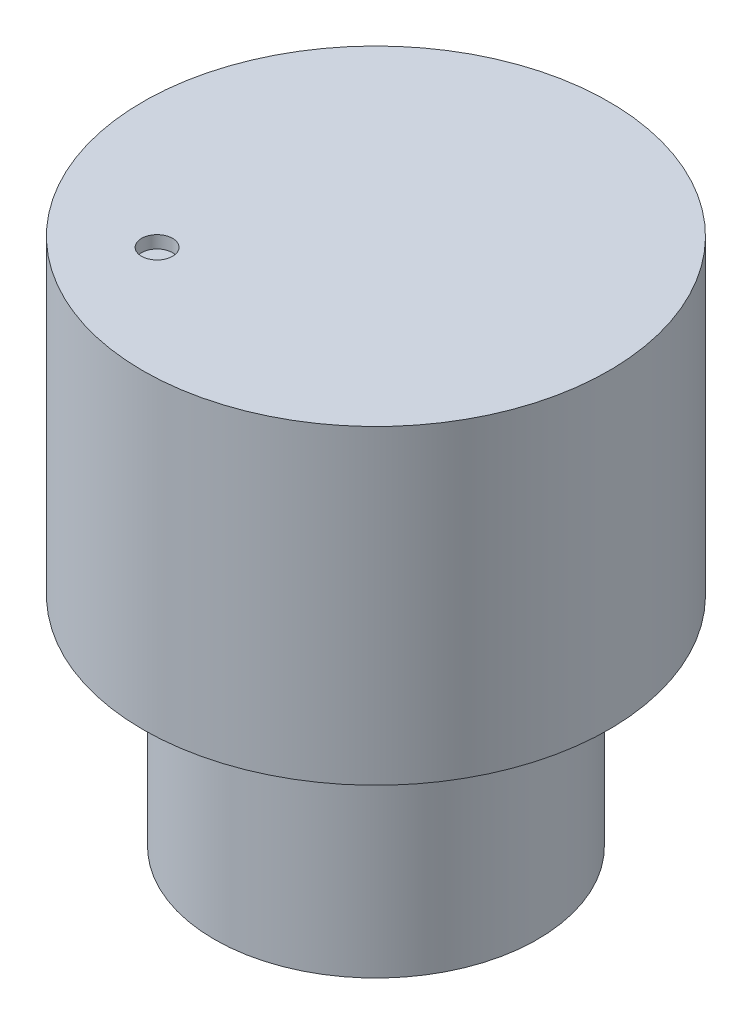
ISO-10303-21;
HEADER;
FILE_DESCRIPTION(('STEP AP214'),'2;1');
FILE_NAME('part.step','',(''),(''),'','','');
FILE_SCHEMA(('AUTOMOTIVE_DESIGN { 1 0 10303 214 1 1 1 1 }'));
ENDSEC;
DATA;
#1=APPLICATION_CONTEXT('core data for automotive mechanical design processes');
#2=APPLICATION_PROTOCOL_DEFINITION('international standard','automotive_design',2000,#1);
#3=PRODUCT_CONTEXT('',#1,'mechanical');
#4=PRODUCT('Part','Part','',(#3));
#5=PRODUCT_RELATED_PRODUCT_CATEGORY('part','',(#4));
#6=PRODUCT_DEFINITION_FORMATION('','',#4);
#7=PRODUCT_DEFINITION_CONTEXT('part definition',#1,'design');
#8=PRODUCT_DEFINITION('design','',#6,#7);
#9=PRODUCT_DEFINITION_SHAPE('','',#8);
#10=(LENGTH_UNIT() NAMED_UNIT(*) SI_UNIT(.MILLI.,.METRE.));
#11=(NAMED_UNIT(*) PLANE_ANGLE_UNIT() SI_UNIT($,.RADIAN.));
#12=(NAMED_UNIT(*) SI_UNIT($,.STERADIAN.) SOLID_ANGLE_UNIT());
#13=UNCERTAINTY_MEASURE_WITH_UNIT(LENGTH_MEASURE(1.E-05),#10,'distance_accuracy_value','');
#14=(GEOMETRIC_REPRESENTATION_CONTEXT(3) GLOBAL_UNCERTAINTY_ASSIGNED_CONTEXT((#13)) GLOBAL_UNIT_ASSIGNED_CONTEXT((#10,
#11,#12)) REPRESENTATION_CONTEXT('',''));
#15=CARTESIAN_POINT('',(0.,0.,0.));
#16=DIRECTION('',(0.,0.,1.));
#17=DIRECTION('',(1.,0.,0.));
#18=AXIS2_PLACEMENT_3D('',#15,#16,#17);
#19=CARTESIAN_POINT('',(0.,7.,0.));
#20=DIRECTION('',(0.,-1.,0.));
#21=DIRECTION('',(0.,0.,-1.));
#22=AXIS2_PLACEMENT_3D('',#19,#20,#21);
#23=CYLINDRICAL_SURFACE('',#22,3.2);
#24=DIRECTION('',(0.,1.,0.));
#25=VECTOR('',#24,1.);
#26=CARTESIAN_POINT('',(-2.64575131106459,2.,-1.8));
#27=LINE('',#26,#25);
#28=CARTESIAN_POINT('',(-2.64575131106459,2.,-1.8));
#29=VERTEX_POINT('',#28);
#30=CARTESIAN_POINT('',(-2.64575131106459,7.,-1.8));
#31=VERTEX_POINT('',#30);
#32=EDGE_CURVE('E90',#29,#31,#27,.T.);
#33=ORIENTED_EDGE('',*,*,#32,.T.);
#34=CARTESIAN_POINT('',(0.,7.,0.));
#35=DIRECTION('',(0.,1.,0.));
#36=DIRECTION('',(0.,0.,1.));
#37=AXIS2_PLACEMENT_3D('',#34,#35,#36);
#38=CIRCLE('',#37,3.2);
#39=CARTESIAN_POINT('',(-3.17490157327751,7.,-0.4));
#40=VERTEX_POINT('',#39);
#41=EDGE_CURVE('E142',#31,#40,#38,.T.);
#42=ORIENTED_EDGE('',*,*,#41,.T.);
#43=DIRECTION('',(0.,1.,0.));
#44=VECTOR('',#43,1.);
#45=CARTESIAN_POINT('',(-3.17490157327751,6.,-0.4));
#46=LINE('',#45,#44);
#47=CARTESIAN_POINT('',(-3.17490157327751,6.,-0.4));
#48=VERTEX_POINT('',#47);
#49=EDGE_CURVE('E130',#48,#40,#46,.T.);
#50=ORIENTED_EDGE('',*,*,#49,.F.);
#51=CARTESIAN_POINT('',(0.,6.,0.));
#52=DIRECTION('',(0.,-1.,0.));
#53=DIRECTION('',(0.,0.,-1.));
#54=AXIS2_PLACEMENT_3D('',#51,#52,#53);
#55=CIRCLE('',#54,3.2);
#56=CARTESIAN_POINT('',(-3.17490157327751,6.,0.4));
#57=VERTEX_POINT('',#56);
#58=EDGE_CURVE('E112',#57,#48,#55,.T.);
#59=ORIENTED_EDGE('',*,*,#58,.F.);
#60=DIRECTION('',(0.,1.,0.));
#61=VECTOR('',#60,1.);
#62=CARTESIAN_POINT('',(-3.17490157327751,6.,0.4));
#63=LINE('',#62,#61);
#64=CARTESIAN_POINT('',(-3.17490157327751,7.,0.4));
#65=VERTEX_POINT('',#64);
#66=EDGE_CURVE('E121',#57,#65,#63,.T.);
#67=ORIENTED_EDGE('',*,*,#66,.T.);
#68=CARTESIAN_POINT('',(3.17490157327751,7.,0.4));
#69=VERTEX_POINT('',#68);
#70=EDGE_CURVE('E137',#65,#69,#38,.T.);
#71=ORIENTED_EDGE('',*,*,#70,.T.);
#72=DIRECTION('',(0.,1.,0.));
#73=VECTOR('',#72,1.);
#74=CARTESIAN_POINT('',(3.17490157327751,6.,0.4));
#75=LINE('',#74,#73);
#76=CARTESIAN_POINT('',(3.17490157327751,6.,0.4));
#77=VERTEX_POINT('',#76);
#78=EDGE_CURVE('E60',#77,#69,#75,.T.);
#79=ORIENTED_EDGE('',*,*,#78,.F.);
#80=CARTESIAN_POINT('',(3.17490157327751,6.,-0.4));
#81=VERTEX_POINT('',#80);
#82=EDGE_CURVE('E117',#81,#77,#55,.T.);
#83=ORIENTED_EDGE('',*,*,#82,.F.);
#84=DIRECTION('',(0.,1.,0.));
#85=VECTOR('',#84,1.);
#86=CARTESIAN_POINT('',(3.17490157327751,6.,-0.4));
#87=LINE('',#86,#85);
#88=CARTESIAN_POINT('',(3.17490157327751,7.,-0.4));
#89=VERTEX_POINT('',#88);
#90=EDGE_CURVE('E127',#81,#89,#87,.T.);
#91=ORIENTED_EDGE('',*,*,#90,.T.);
#92=CARTESIAN_POINT('',(2.64575131106459,7.,-1.8));
#93=VERTEX_POINT('',#92);
#94=EDGE_CURVE('E143',#89,#93,#38,.T.);
#95=ORIENTED_EDGE('',*,*,#94,.T.);
#96=DIRECTION('',(0.,1.,0.));
#97=VECTOR('',#96,1.);
#98=CARTESIAN_POINT('',(2.64575131106459,2.,-1.8));
#99=LINE('',#98,#97);
#100=CARTESIAN_POINT('',(2.64575131106459,2.,-1.8));
#101=VERTEX_POINT('',#100);
#102=EDGE_CURVE('E52',#101,#93,#99,.T.);
#103=ORIENTED_EDGE('',*,*,#102,.F.);
#104=CARTESIAN_POINT('',(0.,2.,0.));
#105=DIRECTION('',(0.,-1.,0.));
#106=DIRECTION('',(0.,0.,-1.));
#107=AXIS2_PLACEMENT_3D('',#104,#105,#106);
#108=CIRCLE('',#107,3.2);
#109=EDGE_CURVE('E102',#29,#101,#108,.T.);
#110=ORIENTED_EDGE('',*,*,#109,.F.);
#111=EDGE_LOOP('',(#33,#42,#50,#59,#67,#71,#79,#83,#91,#95,#103,#110));
#112=FACE_BOUND('',#111,.T.);
#113=CARTESIAN_POINT('',(0.,0.,0.));
#114=DIRECTION('',(0.,1.,0.));
#115=DIRECTION('',(0.,0.,1.));
#116=AXIS2_PLACEMENT_3D('',#113,#114,#115);
#117=CIRCLE('',#116,3.2);
#118=CARTESIAN_POINT('',(0.,0.,3.2));
#119=VERTEX_POINT('',#118);
#120=EDGE_CURVE('E144',#119,#119,#117,.T.);
#121=ORIENTED_EDGE('',*,*,#120,.F.);
#122=EDGE_LOOP('',(#121));
#123=FACE_BOUND('',#122,.T.);
#124=ADVANCED_FACE('F37',(#112,#123),#23,.F.);
#125=CARTESIAN_POINT('',(0.,7.,0.));
#126=DIRECTION('',(0.,1.,0.));
#127=DIRECTION('',(0.,0.,1.));
#128=AXIS2_PLACEMENT_3D('',#125,#126,#127);
#129=PLANE('',#128);
#130=ORIENTED_EDGE('',*,*,#41,.F.);
#131=DIRECTION('',(1.,0.,0.));
#132=VECTOR('',#131,1.);
#133=CARTESIAN_POINT('',(0.,7.,-1.8));
#134=LINE('',#133,#132);
#135=EDGE_CURVE('E94',#31,#93,#134,.T.);
#136=ORIENTED_EDGE('',*,*,#135,.T.);
#137=ORIENTED_EDGE('',*,*,#94,.F.);
#138=DIRECTION('',(1.,0.,0.));
#139=VECTOR('',#138,1.);
#140=CARTESIAN_POINT('',(0.,7.,-0.4));
#141=LINE('',#140,#139);
#142=EDGE_CURVE('E98',#40,#89,#141,.T.);
#143=ORIENTED_EDGE('',*,*,#142,.F.);
#144=EDGE_LOOP('',(#130,#136,#137,#143));
#145=FACE_BOUND('',#144,.T.);
#146=ADVANCED_FACE('F157',(#145),#129,.F.);
#147=CARTESIAN_POINT('',(0.,0.,0.));
#148=DIRECTION('',(0.,1.,0.));
#149=DIRECTION('',(0.,0.,1.));
#150=AXIS2_PLACEMENT_3D('',#147,#148,#149);
#151=PLANE('',#150);
#152=CARTESIAN_POINT('',(0.,0.,0.));
#153=DIRECTION('',(0.,1.,0.));
#154=DIRECTION('',(0.,0.,1.));
#155=AXIS2_PLACEMENT_3D('',#152,#153,#154);
#156=CIRCLE('',#155,5.2);
#157=CARTESIAN_POINT('',(0.,0.,5.2));
#158=VERTEX_POINT('',#157);
#159=EDGE_CURVE('E41',#158,#158,#156,.T.);
#160=ORIENTED_EDGE('',*,*,#159,.F.);
#161=EDGE_LOOP('',(#160));
#162=FACE_BOUND('',#161,.T.);
#163=ORIENTED_EDGE('',*,*,#120,.T.);
#164=EDGE_LOOP('',(#163));
#165=FACE_BOUND('',#164,.T.);
#166=ADVANCED_FACE('F159',(#162,#165),#151,.F.);
#167=CARTESIAN_POINT('',(0.,7.,0.));
#168=DIRECTION('',(0.,-1.,0.));
#169=DIRECTION('',(0.,0.,-1.));
#170=AXIS2_PLACEMENT_3D('',#167,#168,#169);
#171=CYLINDRICAL_SURFACE('',#170,5.2);
#172=CARTESIAN_POINT('',(0.,7.,0.));
#173=DIRECTION('',(0.,1.,0.));
#174=DIRECTION('',(0.,0.,1.));
#175=AXIS2_PLACEMENT_3D('',#172,#173,#174);
#176=CIRCLE('',#175,5.2);
#177=CARTESIAN_POINT('',(0.,7.,5.2));
#178=VERTEX_POINT('',#177);
#179=EDGE_CURVE('E11',#178,#178,#176,.T.);
#180=ORIENTED_EDGE('',*,*,#179,.F.);
#181=EDGE_LOOP('',(#180));
#182=FACE_BOUND('',#181,.T.);
#183=ORIENTED_EDGE('',*,*,#159,.T.);
#184=EDGE_LOOP('',(#183));
#185=FACE_BOUND('',#184,.T.);
#186=ADVANCED_FACE('F39',(#182,#185),#171,.T.);
#187=ORIENTED_EDGE('',*,*,#70,.F.);
#188=DIRECTION('',(1.,0.,0.));
#189=VECTOR('',#188,1.);
#190=CARTESIAN_POINT('',(0.,7.,0.4));
#191=LINE('',#190,#189);
#192=EDGE_CURVE('E116',#65,#69,#191,.T.);
#193=ORIENTED_EDGE('',*,*,#192,.T.);
#194=EDGE_LOOP('',(#187,#193));
#195=FACE_BOUND('',#194,.T.);
#196=ADVANCED_FACE('F161',(#195),#129,.F.);
#197=CARTESIAN_POINT('',(0.,17.,0.));
#198=DIRECTION('',(0.,-1.,0.));
#199=DIRECTION('',(0.,0.,-1.));
#200=AXIS2_PLACEMENT_3D('',#197,#198,#199);
#201=CYLINDRICAL_SURFACE('',#200,7.5);
#202=CARTESIAN_POINT('',(0.,17.,0.));
#203=DIRECTION('',(0.,1.,0.));
#204=DIRECTION('',(0.,0.,1.));
#205=AXIS2_PLACEMENT_3D('',#202,#203,#204);
#206=CIRCLE('',#205,7.5);
#207=CARTESIAN_POINT('',(0.,17.,7.5));
#208=VERTEX_POINT('',#207);
#209=EDGE_CURVE('E134',#208,#208,#206,.T.);
#210=ORIENTED_EDGE('',*,*,#209,.F.);
#211=EDGE_LOOP('',(#210));
#212=FACE_BOUND('',#211,.T.);
#213=CARTESIAN_POINT('',(0.,7.,0.));
#214=DIRECTION('',(0.,1.,0.));
#215=DIRECTION('',(0.,0.,1.));
#216=AXIS2_PLACEMENT_3D('',#213,#214,#215);
#217=CIRCLE('',#216,7.5);
#218=CARTESIAN_POINT('',(0.,7.,7.5));
#219=VERTEX_POINT('',#218);
#220=EDGE_CURVE('E133',#219,#219,#217,.T.);
#221=ORIENTED_EDGE('',*,*,#220,.T.);
#222=EDGE_LOOP('',(#221));
#223=FACE_BOUND('',#222,.T.);
#224=ADVANCED_FACE('F172',(#212,#223),#201,.T.);
#225=CARTESIAN_POINT('',(0.,17.,0.));
#226=DIRECTION('',(0.,1.,0.));
#227=DIRECTION('',(0.,0.,1.));
#228=AXIS2_PLACEMENT_3D('',#225,#226,#227);
#229=PLANE('',#228);
#230=CARTESIAN_POINT('',(-3.21393804843267,17.,3.83022221559491));
#231=DIRECTION('',(0.,1.,0.));
#232=DIRECTION('',(0.,0.,1.));
#233=AXIS2_PLACEMENT_3D('',#230,#231,#232);
#234=CIRCLE('',#233,0.5);
#235=CARTESIAN_POINT('',(-3.21393804843267,17.,4.33022221559491));
#236=VERTEX_POINT('',#235);
#237=EDGE_CURVE('E305',#236,#236,#234,.T.);
#238=ORIENTED_EDGE('',*,*,#237,.F.);
#239=EDGE_LOOP('',(#238));
#240=FACE_BOUND('',#239,.T.);
#241=ORIENTED_EDGE('',*,*,#209,.T.);
#242=EDGE_LOOP('',(#241));
#243=FACE_BOUND('',#242,.T.);
#244=ADVANCED_FACE('F175',(#240,#243),#229,.T.);
#245=ORIENTED_EDGE('',*,*,#179,.T.);
#246=EDGE_LOOP('',(#245));
#247=FACE_BOUND('',#246,.T.);
#248=ORIENTED_EDGE('',*,*,#220,.F.);
#249=EDGE_LOOP('',(#248));
#250=FACE_BOUND('',#249,.T.);
#251=ADVANCED_FACE('F162',(#247,#250),#129,.F.);
#252=CARTESIAN_POINT('',(0.,6.,-0.4));
#253=DIRECTION('',(0.,0.,1.));
#254=DIRECTION('',(1.,0.,0.));
#255=AXIS2_PLACEMENT_3D('',#252,#253,#254);
#256=PLANE('',#255);
#257=ORIENTED_EDGE('',*,*,#142,.T.);
#258=ORIENTED_EDGE('',*,*,#90,.F.);
#259=DIRECTION('',(1.,0.,0.));
#260=VECTOR('',#259,1.);
#261=CARTESIAN_POINT('',(0.,6.,-0.4));
#262=LINE('',#261,#260);
#263=EDGE_CURVE('E115',#48,#81,#262,.T.);
#264=ORIENTED_EDGE('',*,*,#263,.F.);
#265=ORIENTED_EDGE('',*,*,#49,.T.);
#266=EDGE_LOOP('',(#257,#258,#264,#265));
#267=FACE_BOUND('',#266,.T.);
#268=ADVANCED_FACE('F155',(#267),#256,.F.);
#269=CARTESIAN_POINT('',(0.,6.,0.4));
#270=DIRECTION('',(0.,0.,1.));
#271=DIRECTION('',(1.,0.,0.));
#272=AXIS2_PLACEMENT_3D('',#269,#270,#271);
#273=PLANE('',#272);
#274=ORIENTED_EDGE('',*,*,#192,.F.);
#275=ORIENTED_EDGE('',*,*,#66,.F.);
#276=DIRECTION('',(1.,0.,0.));
#277=VECTOR('',#276,1.);
#278=CARTESIAN_POINT('',(0.,6.,0.4));
#279=LINE('',#278,#277);
#280=EDGE_CURVE('E119',#57,#77,#279,.T.);
#281=ORIENTED_EDGE('',*,*,#280,.T.);
#282=ORIENTED_EDGE('',*,*,#78,.T.);
#283=EDGE_LOOP('',(#274,#275,#281,#282));
#284=FACE_BOUND('',#283,.T.);
#285=ADVANCED_FACE('F181',(#284),#273,.T.);
#286=CARTESIAN_POINT('',(0.,6.,0.));
#287=DIRECTION('',(0.,-1.,0.));
#288=DIRECTION('',(0.,0.,-1.));
#289=AXIS2_PLACEMENT_3D('',#286,#287,#288);
#290=PLANE('',#289);
#291=ORIENTED_EDGE('',*,*,#58,.T.);
#292=ORIENTED_EDGE('',*,*,#263,.T.);
#293=ORIENTED_EDGE('',*,*,#82,.T.);
#294=ORIENTED_EDGE('',*,*,#280,.F.);
#295=EDGE_LOOP('',(#291,#292,#293,#294));
#296=FACE_BOUND('',#295,.T.);
#297=ADVANCED_FACE('F237',(#296),#290,.T.);
#298=CARTESIAN_POINT('',(0.,2.,-1.8));
#299=DIRECTION('',(0.,0.,1.));
#300=DIRECTION('',(1.,0.,0.));
#301=AXIS2_PLACEMENT_3D('',#298,#299,#300);
#302=PLANE('',#301);
#303=ORIENTED_EDGE('',*,*,#135,.F.);
#304=ORIENTED_EDGE('',*,*,#32,.F.);
#305=DIRECTION('',(1.,0.,0.));
#306=VECTOR('',#305,1.);
#307=CARTESIAN_POINT('',(0.,2.,-1.8));
#308=LINE('',#307,#306);
#309=EDGE_CURVE('E93',#29,#101,#308,.T.);
#310=ORIENTED_EDGE('',*,*,#309,.T.);
#311=ORIENTED_EDGE('',*,*,#102,.T.);
#312=EDGE_LOOP('',(#303,#304,#310,#311));
#313=FACE_BOUND('',#312,.T.);
#314=ADVANCED_FACE('F92',(#313),#302,.T.);
#315=CARTESIAN_POINT('',(0.,2.,0.));
#316=DIRECTION('',(0.,-1.,0.));
#317=DIRECTION('',(0.,0.,-1.));
#318=AXIS2_PLACEMENT_3D('',#315,#316,#317);
#319=PLANE('',#318);
#320=ORIENTED_EDGE('',*,*,#309,.F.);
#321=ORIENTED_EDGE('',*,*,#109,.T.);
#322=EDGE_LOOP('',(#320,#321));
#323=FACE_BOUND('',#322,.T.);
#324=ADVANCED_FACE('F101',(#323),#319,.T.);
#325=CARTESIAN_POINT('',(-3.21393804843267,16.6,3.83022221559491));
#326=DIRECTION('',(0.,1.,0.));
#327=DIRECTION('',(0.,0.,1.));
#328=AXIS2_PLACEMENT_3D('',#325,#326,#327);
#329=CYLINDRICAL_SURFACE('',#328,0.5);
#330=CARTESIAN_POINT('',(-3.21393804843267,16.6,3.83022221559491));
#331=DIRECTION('',(0.,1.,0.));
#332=DIRECTION('',(0.,0.,1.));
#333=AXIS2_PLACEMENT_3D('',#330,#331,#332);
#334=CIRCLE('',#333,0.5);
#335=CARTESIAN_POINT('',(-3.21393804843267,16.6,4.33022221559491));
#336=VERTEX_POINT('',#335);
#337=EDGE_CURVE('E110',#336,#336,#334,.T.);
#338=ORIENTED_EDGE('',*,*,#337,.F.);
#339=EDGE_LOOP('',(#338));
#340=FACE_BOUND('',#339,.T.);
#341=ORIENTED_EDGE('',*,*,#237,.T.);
#342=EDGE_LOOP('',(#341));
#343=FACE_BOUND('',#342,.T.);
#344=ADVANCED_FACE('F213',(#340,#343),#329,.F.);
#345=CARTESIAN_POINT('',(-3.21393804843267,16.6,3.83022221559491));
#346=DIRECTION('',(0.,1.,0.));
#347=DIRECTION('',(0.,0.,1.));
#348=AXIS2_PLACEMENT_3D('',#345,#346,#347);
#349=PLANE('',#348);
#350=ORIENTED_EDGE('',*,*,#337,.T.);
#351=EDGE_LOOP('',(#350));
#352=FACE_BOUND('',#351,.T.);
#353=ADVANCED_FACE('F218',(#352),#349,.T.);
#354=CLOSED_SHELL('',(#124,#146,#166,#186,#196,#224,#244,#251,#268,#285,#297,#314,#324,#344,#353));
#355=MANIFOLD_SOLID_BREP('B2',#354);
#356=ADVANCED_BREP_SHAPE_REPRESENTATION('',(#18,#355),#14);
#357=SHAPE_DEFINITION_REPRESENTATION(#9,#356);
ENDSEC;
END-ISO-10303-21;
